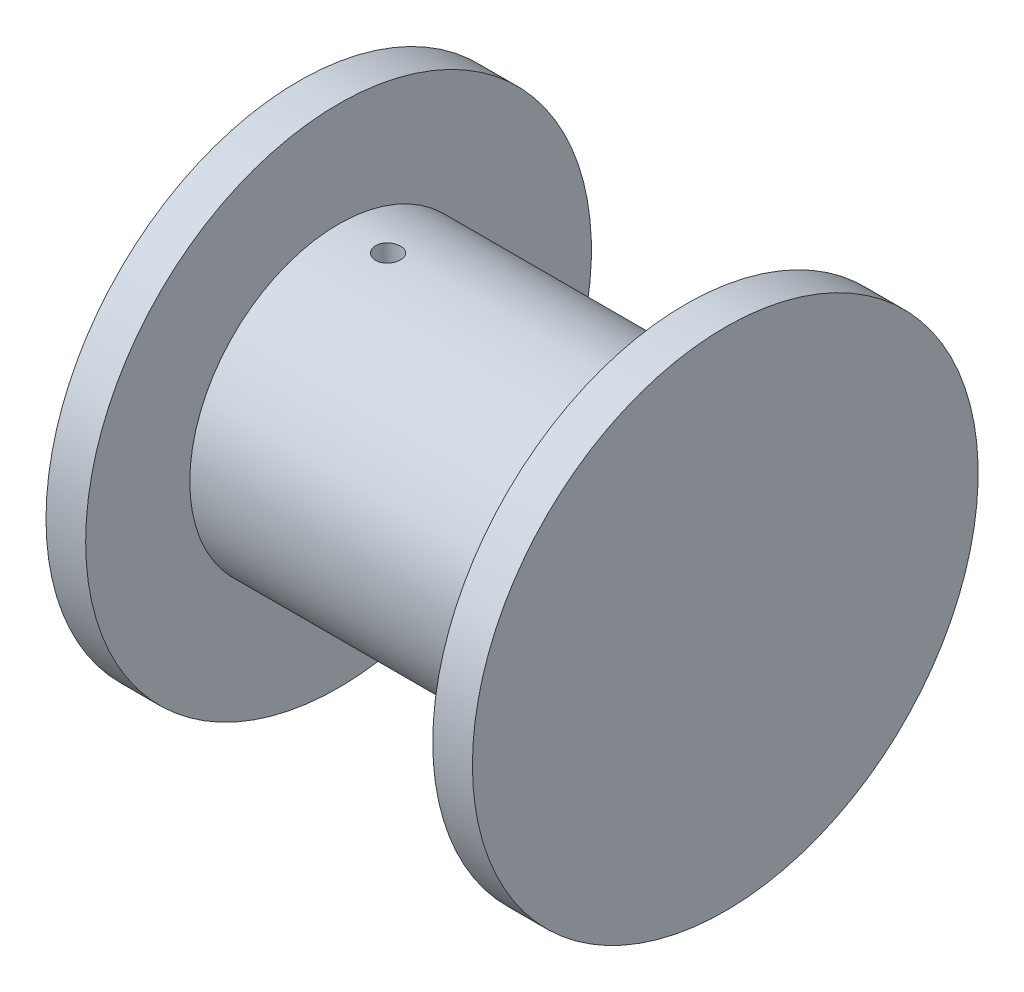
ISO-10303-21;
HEADER;
FILE_DESCRIPTION(('STEP AP214'),'2;1');
FILE_NAME('part.step','',(''),(''),'','','');
FILE_SCHEMA(('AUTOMOTIVE_DESIGN { 1 0 10303 214 1 1 1 1 }'));
ENDSEC;
DATA;
#1=APPLICATION_CONTEXT('core data for automotive mechanical design processes');
#2=APPLICATION_PROTOCOL_DEFINITION('international standard','automotive_design',2000,#1);
#3=PRODUCT_CONTEXT('',#1,'mechanical');
#4=PRODUCT('Part','Part','',(#3));
#5=PRODUCT_RELATED_PRODUCT_CATEGORY('part','',(#4));
#6=PRODUCT_DEFINITION_FORMATION('','',#4);
#7=PRODUCT_DEFINITION_CONTEXT('part definition',#1,'design');
#8=PRODUCT_DEFINITION('design','',#6,#7);
#9=PRODUCT_DEFINITION_SHAPE('','',#8);
#10=(LENGTH_UNIT() NAMED_UNIT(*) SI_UNIT(.MILLI.,.METRE.));
#11=(NAMED_UNIT(*) PLANE_ANGLE_UNIT() SI_UNIT($,.RADIAN.));
#12=(NAMED_UNIT(*) SI_UNIT($,.STERADIAN.) SOLID_ANGLE_UNIT());
#13=UNCERTAINTY_MEASURE_WITH_UNIT(LENGTH_MEASURE(1.E-05),#10,'distance_accuracy_value','');
#14=(GEOMETRIC_REPRESENTATION_CONTEXT(3) GLOBAL_UNCERTAINTY_ASSIGNED_CONTEXT((#13)) GLOBAL_UNIT_ASSIGNED_CONTEXT((#10,
#11,#12)) REPRESENTATION_CONTEXT('',''));
#15=CARTESIAN_POINT('',(0.,0.,0.));
#16=DIRECTION('',(0.,0.,1.));
#17=DIRECTION('',(1.,0.,0.));
#18=AXIS2_PLACEMENT_3D('',#15,#16,#17);
#19=CARTESIAN_POINT('',(0.,3.,0.));
#20=DIRECTION('',(1.,0.,0.));
#21=DIRECTION('',(0.,0.,-1.));
#22=AXIS2_PLACEMENT_3D('',#19,#20,#21);
#23=PLANE('',#22);
#24=DIRECTION('',(0.,0.,-1.));
#25=VECTOR('',#24,1.);
#26=CARTESIAN_POINT('',(0.,2.5,-1.6583123951777));
#27=LINE('',#26,#25);
#28=CARTESIAN_POINT('',(0.,2.5,1.6583123951777));
#29=VERTEX_POINT('',#28);
#30=CARTESIAN_POINT('',(0.,2.5,-1.6583123951777));
#31=VERTEX_POINT('',#30);
#32=EDGE_CURVE('E82',#29,#31,#27,.T.);
#33=ORIENTED_EDGE('',*,*,#32,.F.);
#34=CARTESIAN_POINT('',(0.,0.,0.));
#35=DIRECTION('',(-1.,0.,0.));
#36=DIRECTION('',(0.,0.,1.));
#37=AXIS2_PLACEMENT_3D('',#34,#35,#36);
#38=CIRCLE('',#37,3.);
#39=EDGE_CURVE('E65',#31,#29,#38,.T.);
#40=ORIENTED_EDGE('',*,*,#39,.F.);
#41=EDGE_LOOP('',(#33,#40));
#42=FACE_BOUND('',#41,.T.);
#43=CARTESIAN_POINT('',(0.,0.,0.));
#44=DIRECTION('',(-1.,0.,0.));
#45=DIRECTION('',(0.,0.,1.));
#46=AXIS2_PLACEMENT_3D('',#43,#44,#45);
#47=CIRCLE('',#46,25.5);
#48=CARTESIAN_POINT('',(0.,0.,25.5));
#49=VERTEX_POINT('',#48);
#50=EDGE_CURVE('E11',#49,#49,#47,.T.);
#51=ORIENTED_EDGE('',*,*,#50,.T.);
#52=EDGE_LOOP('',(#51));
#53=FACE_BOUND('',#52,.T.);
#54=ADVANCED_FACE('F50',(#42,#53),#23,.F.);
#55=CARTESIAN_POINT('',(0.,0.,0.));
#56=DIRECTION('',(-1.,0.,0.));
#57=DIRECTION('',(0.,0.,1.));
#58=AXIS2_PLACEMENT_3D('',#55,#56,#57);
#59=CYLINDRICAL_SURFACE('',#58,25.5);
#60=ORIENTED_EDGE('',*,*,#50,.F.);
#61=EDGE_LOOP('',(#60));
#62=FACE_BOUND('',#61,.T.);
#63=CARTESIAN_POINT('',(4.,0.,0.));
#64=DIRECTION('',(-1.,0.,0.));
#65=DIRECTION('',(0.,0.,1.));
#66=AXIS2_PLACEMENT_3D('',#63,#64,#65);
#67=CIRCLE('',#66,25.5);
#68=CARTESIAN_POINT('',(4.,0.,25.5));
#69=VERTEX_POINT('',#68);
#70=EDGE_CURVE('E54',#69,#69,#67,.T.);
#71=ORIENTED_EDGE('',*,*,#70,.T.);
#72=EDGE_LOOP('',(#71));
#73=FACE_BOUND('',#72,.T.);
#74=ADVANCED_FACE('F122',(#62,#73),#59,.T.);
#75=CARTESIAN_POINT('',(4.,25.5,0.));
#76=DIRECTION('',(-1.,0.,0.));
#77=DIRECTION('',(0.,0.,1.));
#78=AXIS2_PLACEMENT_3D('',#75,#76,#77);
#79=PLANE('',#78);
#80=ORIENTED_EDGE('',*,*,#70,.F.);
#81=EDGE_LOOP('',(#80));
#82=FACE_BOUND('',#81,.T.);
#83=CARTESIAN_POINT('',(4.,0.,0.));
#84=DIRECTION('',(-1.,0.,0.));
#85=DIRECTION('',(0.,0.,1.));
#86=AXIS2_PLACEMENT_3D('',#83,#84,#85);
#87=CIRCLE('',#86,15.);
#88=CARTESIAN_POINT('',(4.,0.,15.));
#89=VERTEX_POINT('',#88);
#90=EDGE_CURVE('E160',#89,#89,#87,.T.);
#91=ORIENTED_EDGE('',*,*,#90,.T.);
#92=EDGE_LOOP('',(#91));
#93=FACE_BOUND('',#92,.T.);
#94=ADVANCED_FACE('F123',(#82,#93),#79,.F.);
#95=CARTESIAN_POINT('',(0.,0.,0.));
#96=DIRECTION('',(-1.,0.,0.));
#97=DIRECTION('',(0.,0.,1.));
#98=AXIS2_PLACEMENT_3D('',#95,#96,#97);
#99=CYLINDRICAL_SURFACE('',#98,15.);
#100=CARTESIAN_POINT('',(9.,14.9478259288767,-1.24999999999999));
#101=CARTESIAN_POINT('',(9.07008213598801,14.9478266201045,-1.24999693853797));
#102=CARTESIAN_POINT('',(9.1402119826971,14.9483240997827,-1.24408636494977));
#103=CARTESIAN_POINT('',(9.27853127542929,14.9502602468658,-1.22059497384285));
#104=CARTESIAN_POINT('',(9.34671843140951,14.9516999806891,-1.20300093295206));
#105=CARTESIAN_POINT('',(9.47912899515666,14.9553564437001,-1.1566549809219));
#106=CARTESIAN_POINT('',(9.54335462619369,14.95757273232,-1.1279093954694));
#107=CARTESIAN_POINT('',(9.66605399401239,14.9625320337702,-1.06008758560681));
#108=CARTESIAN_POINT('',(9.7245289568188,14.9652749339588,-1.02101356976586));
#109=CARTESIAN_POINT('',(9.8342325038333,14.9709863097435,-0.933535670572537));
#110=CARTESIAN_POINT('',(9.8854442898287,14.9739552846129,-0.885110751752341));
#111=CARTESIAN_POINT('',(9.97902345779753,14.9797797076347,-0.780350150845112));
#112=CARTESIAN_POINT('',(10.0213904533595,14.9826351508228,-0.724014123317092));
#113=CARTESIAN_POINT('',(10.0961332683202,14.987915506344,-0.604930306635983));
#114=CARTESIAN_POINT('',(10.1284945539768,14.9903397902493,-0.54217336515732));
#115=CARTESIAN_POINT('',(10.1822143638981,14.9944792971536,-0.41209300062345));
#116=CARTESIAN_POINT('',(10.2035730807477,14.9961945325633,-0.344769657520199));
#117=CARTESIAN_POINT('',(10.23463310482,14.9987191931584,-0.207634744934761));
#118=CARTESIAN_POINT('',(10.2443615888993,14.9995307297494,-0.1378293702904));
#119=CARTESIAN_POINT('',(10.2519690039807,15.0001637091778,0.00242785236227524));
#120=CARTESIAN_POINT('',(10.2498481553374,14.999985170427,0.0728796883244364));
#121=CARTESIAN_POINT('',(10.2338393347758,14.9986598579849,0.212245689398518));
#122=CARTESIAN_POINT('',(10.2199805877447,14.9975154890316,0.281163237590581));
#123=CARTESIAN_POINT('',(10.1809348112974,14.9943899981827,0.415690582550305));
#124=CARTESIAN_POINT('',(10.1557476740968,14.9924088683258,0.481300347839376));
#125=CARTESIAN_POINT('',(10.0947275161018,14.9878285989037,0.607442700796068));
#126=CARTESIAN_POINT('',(10.0588814067515,14.985228700317,0.667968928323714));
#127=CARTESIAN_POINT('',(9.97757034802672,14.9797030658656,0.782156669846708));
#128=CARTESIAN_POINT('',(9.93210520354297,14.9767773233922,0.835818044562334));
#129=CARTESIAN_POINT('',(9.83268195005593,14.9709183093409,0.934923705977366));
#130=CARTESIAN_POINT('',(9.77869844647649,14.9679850419083,0.980342520831279));
#131=CARTESIAN_POINT('',(9.66385936860459,14.9624505221547,1.06147699865338));
#132=CARTESIAN_POINT('',(9.60300378864728,14.9598492701074,1.09719265362289));
#133=CARTESIAN_POINT('',(9.47613014028524,14.9552728262123,1.15790600574156));
#134=CARTESIAN_POINT('',(9.41011143631638,14.9532977115918,1.18290238091837));
#135=CARTESIAN_POINT('',(9.27479410243625,14.9501986659998,1.22144875878563));
#136=CARTESIAN_POINT('',(9.20549554151275,14.9490747171335,1.23499900211849));
#137=CARTESIAN_POINT('',(9.06580851680588,14.9478081612067,1.25023622864076));
#138=CARTESIAN_POINT('',(8.99542395319139,14.947662615853,1.25195873264735));
#139=CARTESIAN_POINT('',(8.85536707043796,14.9483615901727,1.24358463130602));
#140=CARTESIAN_POINT('',(8.78569474466182,14.9492061006115,1.23348813619852));
#141=CARTESIAN_POINT('',(8.64914205525057,14.9517873518093,1.20179225155309));
#142=CARTESIAN_POINT('',(8.58225781754613,14.9535228066559,1.18020943873681));
#143=CARTESIAN_POINT('',(8.45305989729533,14.9576893372452,1.12617042778729));
#144=CARTESIAN_POINT('',(8.39074628810591,14.9601204241495,1.09371405518383));
#145=CARTESIAN_POINT('',(8.27229593472593,14.9654114182898,1.01875935997368));
#146=CARTESIAN_POINT('',(8.21617421450198,14.9682723304176,0.976237367106289));
#147=CARTESIAN_POINT('',(8.11185257386646,14.9740972221722,0.882392660519378));
#148=CARTESIAN_POINT('',(8.06365278979711,14.9770612035719,0.831069795361578));
#149=CARTESIAN_POINT('',(7.97642199278746,14.9827670138603,0.720926716139674));
#150=CARTESIAN_POINT('',(7.9374140587461,14.9855082724759,0.662088190512283));
#151=CARTESIAN_POINT('',(7.86983260804433,14.9904515483882,0.538675241518001));
#152=CARTESIAN_POINT('',(7.84125898711412,14.9926535710734,0.474100875477216));
#153=CARTESIAN_POINT('',(7.79539689697991,14.9962676402419,0.341131973458794));
#154=CARTESIAN_POINT('',(7.77809415606771,14.9976806854396,0.272742388150755));
#155=CARTESIAN_POINT('',(7.75521834280739,14.9995616416229,0.134016473832872));
#156=CARTESIAN_POINT('',(7.74964504843554,15.0000295704984,0.0636801816972841));
#157=CARTESIAN_POINT('',(7.75038892450123,14.9999675984173,-0.0767150604948783));
#158=CARTESIAN_POINT('',(7.75667012729819,14.9994407158086,-0.146774205264233));
#159=CARTESIAN_POINT('',(7.78086969313943,14.9974542924443,-0.284838890076666));
#160=CARTESIAN_POINT('',(7.79878807198964,14.9959947504219,-0.352844427330349));
#161=CARTESIAN_POINT('',(7.84574421265297,14.9923067712992,-0.484873808060936));
#162=CARTESIAN_POINT('',(7.87478132835369,14.9900783788777,-0.548897882650322));
#163=CARTESIAN_POINT('',(7.94314655674712,14.9851019995099,-0.671168216123773));
#164=CARTESIAN_POINT('',(7.982474506699,14.9823540207807,-0.729414566357567));
#165=CARTESIAN_POINT('',(8.07044001856136,14.9766369812704,-0.838660111781818));
#166=CARTESIAN_POINT('',(8.11910419418319,14.9736673036685,-0.889637844980762));
#167=CARTESIAN_POINT('',(8.22431271090746,14.9678468122527,-0.982722283199423));
#168=CARTESIAN_POINT('',(8.28085895760362,14.9649960273997,-1.02482683681028));
#169=CARTESIAN_POINT('',(8.40033625087618,14.9597303051085,-1.09902672372356));
#170=CARTESIAN_POINT('',(8.46327906250155,14.9573161943526,-1.13110315432307));
#171=CARTESIAN_POINT('',(8.59363429591827,14.9532072450657,-1.18419112616724));
#172=CARTESIAN_POINT('',(8.66104147802154,14.9515115800288,-1.20521538866183));
#173=CARTESIAN_POINT('',(8.77403860528399,14.9494676023508,-1.2302476225076));
#174=CARTESIAN_POINT('',(8.81890181597321,14.9488548048632,-1.23764491757304));
#175=CARTESIAN_POINT('',(8.90917000396857,14.9480337446537,-1.24752209188332));
#176=CARTESIAN_POINT('',(8.95457497981849,14.9478254808448,-1.25000198434268));
#177=CARTESIAN_POINT('',(9.,14.9478259288767,-1.24999999999999));
#178=B_SPLINE_CURVE_WITH_KNOTS('',3,(#100,#101,#102,#103,#104,#105,#106,#107,#108,#109,#110,
#111,#112,#113,#114,#115,#116,#117,#118,#119,#120,#121,#122,#123,#124,#125,#126,#127,#128,#129,
#130,#131,#132,#133,#134,#135,#136,#137,#138,#139,#140,#141,#142,#143,#144,#145,#146,#147,#148,
#149,#150,#151,#152,#153,#154,#155,#156,#157,#158,#159,#160,#161,#162,#163,#164,#165,#166,#167,
#168,#169,#170,#171,#172,#173,#174,#175,#176,#177),.UNSPECIFIED.,.T.,.F.,(4,2,2,2,2,2,2,2,2,2,2,
2,2,2,2,2,2,2,2,2,2,2,2,2,2,2,2,2,2,2,2,2,2,2,2,2,2,2,4),(0.,0.210080552563243,
0.420399280896463,0.630598880471488,0.840753568544776,1.05138663986468,1.26202891140375,
1.47297572825589,1.68391885264721,1.89436808777527,2.10481340932629,2.31473630155853,
2.52466119114968,2.73484492751255,2.94503292757807,3.15585980028505,3.36668684678381,
3.57753988639349,3.78838849293801,3.99860360537381,4.20881675706682,4.41872735462255,
4.62864132043178,4.83905391053753,5.04947012161601,5.26040914671227,5.47134606384324,
5.68201536101251,5.89268067043989,6.10270782921739,6.31273527325995,6.52275051441032,
6.73276243454835,6.94338215404612,7.15405288221721,7.36511835673391,7.57594035609225,
7.71210828034495,7.84827583867337),.UNSPECIFIED.);
#179=CARTESIAN_POINT('',(9.,14.9478259288767,-1.24999999999999));
#180=VERTEX_POINT('',#179);
#181=EDGE_CURVE('E92',#180,#180,#178,.T.);
#182=ORIENTED_EDGE('',*,*,#181,.T.);
#183=EDGE_LOOP('',(#182));
#184=FACE_BOUND('',#183,.T.);
#185=ORIENTED_EDGE('',*,*,#90,.F.);
#186=EDGE_LOOP('',(#185));
#187=FACE_BOUND('',#186,.T.);
#188=CARTESIAN_POINT('',(39.,0.,0.));
#189=DIRECTION('',(-1.,0.,0.));
#190=DIRECTION('',(0.,0.,1.));
#191=AXIS2_PLACEMENT_3D('',#188,#189,#190);
#192=CIRCLE('',#191,15.);
#193=CARTESIAN_POINT('',(39.,0.,15.));
#194=VERTEX_POINT('',#193);
#195=EDGE_CURVE('E153',#194,#194,#192,.T.);
#196=ORIENTED_EDGE('',*,*,#195,.T.);
#197=EDGE_LOOP('',(#196));
#198=FACE_BOUND('',#197,.T.);
#199=ADVANCED_FACE('F128',(#184,#187,#198),#99,.T.);
#200=CARTESIAN_POINT('',(39.,15.,0.));
#201=DIRECTION('',(1.,0.,0.));
#202=DIRECTION('',(0.,0.,-1.));
#203=AXIS2_PLACEMENT_3D('',#200,#201,#202);
#204=PLANE('',#203);
#205=ORIENTED_EDGE('',*,*,#195,.F.);
#206=EDGE_LOOP('',(#205));
#207=FACE_BOUND('',#206,.T.);
#208=CARTESIAN_POINT('',(39.,0.,0.));
#209=DIRECTION('',(-1.,0.,0.));
#210=DIRECTION('',(0.,0.,1.));
#211=AXIS2_PLACEMENT_3D('',#208,#209,#210);
#212=CIRCLE('',#211,25.5);
#213=CARTESIAN_POINT('',(39.,0.,25.5));
#214=VERTEX_POINT('',#213);
#215=EDGE_CURVE('E155',#214,#214,#212,.T.);
#216=ORIENTED_EDGE('',*,*,#215,.T.);
#217=EDGE_LOOP('',(#216));
#218=FACE_BOUND('',#217,.T.);
#219=ADVANCED_FACE('F137',(#207,#218),#204,.F.);
#220=CARTESIAN_POINT('',(0.,0.,0.));
#221=DIRECTION('',(-1.,0.,0.));
#222=DIRECTION('',(0.,0.,1.));
#223=AXIS2_PLACEMENT_3D('',#220,#221,#222);
#224=CYLINDRICAL_SURFACE('',#223,25.5);
#225=ORIENTED_EDGE('',*,*,#215,.F.);
#226=EDGE_LOOP('',(#225));
#227=FACE_BOUND('',#226,.T.);
#228=CARTESIAN_POINT('',(43.,0.,0.));
#229=DIRECTION('',(-1.,0.,0.));
#230=DIRECTION('',(0.,0.,1.));
#231=AXIS2_PLACEMENT_3D('',#228,#229,#230);
#232=CIRCLE('',#231,25.5);
#233=CARTESIAN_POINT('',(43.,0.,25.5));
#234=VERTEX_POINT('',#233);
#235=EDGE_CURVE('E103',#234,#234,#232,.T.);
#236=ORIENTED_EDGE('',*,*,#235,.T.);
#237=EDGE_LOOP('',(#236));
#238=FACE_BOUND('',#237,.T.);
#239=ADVANCED_FACE('F145',(#227,#238),#224,.T.);
#240=CARTESIAN_POINT('',(43.,3.,0.));
#241=DIRECTION('',(-1.,0.,0.));
#242=DIRECTION('',(0.,0.,1.));
#243=AXIS2_PLACEMENT_3D('',#240,#241,#242);
#244=PLANE('',#243);
#245=ORIENTED_EDGE('',*,*,#235,.F.);
#246=EDGE_LOOP('',(#245));
#247=FACE_BOUND('',#246,.T.);
#248=ADVANCED_FACE('F107',(#247),#244,.F.);
#249=CARTESIAN_POINT('',(9.,0.,0.));
#250=DIRECTION('',(0.,-1.,0.));
#251=DIRECTION('',(0.,0.,-1.));
#252=AXIS2_PLACEMENT_3D('',#249,#250,#251);
#253=CYLINDRICAL_SURFACE('',#252,1.24999999999999);
#254=CARTESIAN_POINT('',(9.,2.5,0.));
#255=DIRECTION('',(0.,1.,0.));
#256=DIRECTION('',(0.,0.,1.));
#257=AXIS2_PLACEMENT_3D('',#254,#255,#256);
#258=CIRCLE('',#257,1.24999999999999);
#259=CARTESIAN_POINT('',(9.,2.5,1.24999999999999));
#260=VERTEX_POINT('',#259);
#261=EDGE_CURVE('E49',#260,#260,#258,.F.);
#262=ORIENTED_EDGE('',*,*,#261,.T.);
#263=EDGE_LOOP('',(#262));
#264=FACE_BOUND('',#263,.T.);
#265=ORIENTED_EDGE('',*,*,#181,.F.);
#266=EDGE_LOOP('',(#265));
#267=FACE_BOUND('',#266,.T.);
#268=ADVANCED_FACE('F102',(#264,#267),#253,.F.);
#269=CARTESIAN_POINT('',(12.,2.5,-1.6583123951777));
#270=DIRECTION('',(0.,1.,0.));
#271=DIRECTION('',(0.,0.,1.));
#272=AXIS2_PLACEMENT_3D('',#269,#270,#271);
#273=PLANE('',#272);
#274=ORIENTED_EDGE('',*,*,#32,.T.);
#275=DIRECTION('',(-1.,0.,0.));
#276=VECTOR('',#275,1.);
#277=CARTESIAN_POINT('',(12.,2.5,-1.6583123951777));
#278=LINE('',#277,#276);
#279=CARTESIAN_POINT('',(12.,2.5,-1.6583123951777));
#280=VERTEX_POINT('',#279);
#281=EDGE_CURVE('E68',#280,#31,#278,.T.);
#282=ORIENTED_EDGE('',*,*,#281,.F.);
#283=DIRECTION('',(0.,0.,-1.));
#284=VECTOR('',#283,1.);
#285=CARTESIAN_POINT('',(12.,2.5,-1.6583123951777));
#286=LINE('',#285,#284);
#287=CARTESIAN_POINT('',(12.,2.5,1.6583123951777));
#288=VERTEX_POINT('',#287);
#289=EDGE_CURVE('E86',#288,#280,#286,.T.);
#290=ORIENTED_EDGE('',*,*,#289,.F.);
#291=DIRECTION('',(-1.,0.,0.));
#292=VECTOR('',#291,1.);
#293=CARTESIAN_POINT('',(12.,2.5,1.6583123951777));
#294=LINE('',#293,#292);
#295=EDGE_CURVE('E76',#288,#29,#294,.T.);
#296=ORIENTED_EDGE('',*,*,#295,.T.);
#297=EDGE_LOOP('',(#274,#282,#290,#296));
#298=FACE_BOUND('',#297,.T.);
#299=ORIENTED_EDGE('',*,*,#261,.F.);
#300=EDGE_LOOP('',(#299));
#301=FACE_BOUND('',#300,.T.);
#302=ADVANCED_FACE('F85',(#298,#301),#273,.F.);
#303=CARTESIAN_POINT('',(12.,0.,0.));
#304=DIRECTION('',(-1.,0.,0.));
#305=DIRECTION('',(0.,0.,1.));
#306=AXIS2_PLACEMENT_3D('',#303,#304,#305);
#307=CYLINDRICAL_SURFACE('',#306,3.);
#308=ORIENTED_EDGE('',*,*,#39,.T.);
#309=ORIENTED_EDGE('',*,*,#295,.F.);
#310=CARTESIAN_POINT('',(12.,0.,0.));
#311=DIRECTION('',(-1.,0.,0.));
#312=DIRECTION('',(0.,0.,1.));
#313=AXIS2_PLACEMENT_3D('',#310,#311,#312);
#314=CIRCLE('',#313,3.);
#315=EDGE_CURVE('E77',#280,#288,#314,.T.);
#316=ORIENTED_EDGE('',*,*,#315,.F.);
#317=ORIENTED_EDGE('',*,*,#281,.T.);
#318=EDGE_LOOP('',(#308,#309,#316,#317));
#319=FACE_BOUND('',#318,.T.);
#320=ADVANCED_FACE('F75',(#319),#307,.F.);
#321=CARTESIAN_POINT('',(12.,0.,0.));
#322=DIRECTION('',(-1.,0.,0.));
#323=DIRECTION('',(0.,0.,1.));
#324=AXIS2_PLACEMENT_3D('',#321,#322,#323);
#325=PLANE('',#324);
#326=ORIENTED_EDGE('',*,*,#315,.T.);
#327=ORIENTED_EDGE('',*,*,#289,.T.);
#328=EDGE_LOOP('',(#326,#327));
#329=FACE_BOUND('',#328,.T.);
#330=ADVANCED_FACE('F113',(#329),#325,.T.);
#331=CLOSED_SHELL('',(#54,#74,#94,#199,#219,#239,#248,#268,#302,#320,#330));
#332=MANIFOLD_SOLID_BREP('B2',#331);
#333=ADVANCED_BREP_SHAPE_REPRESENTATION('',(#18,#332),#14);
#334=SHAPE_DEFINITION_REPRESENTATION(#9,#333);
ENDSEC;
END-ISO-10303-21;
